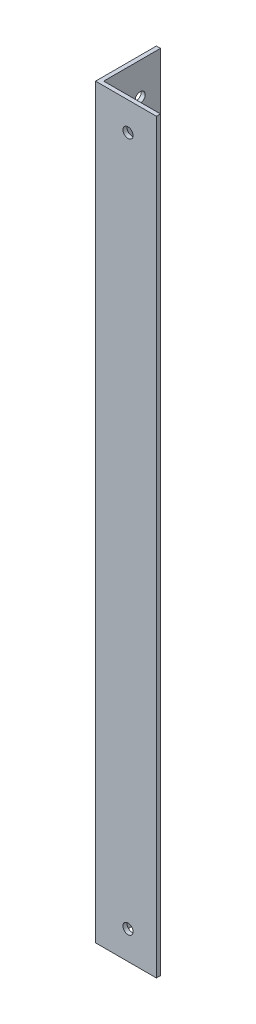
ISO-10303-21;
HEADER;
FILE_DESCRIPTION(('STEP AP214'),'2;1');
FILE_NAME('part.step','',(''),(''),'','','');
FILE_SCHEMA(('AUTOMOTIVE_DESIGN { 1 0 10303 214 1 1 1 1 }'));
ENDSEC;
DATA;
#1=APPLICATION_CONTEXT('core data for automotive mechanical design processes');
#2=APPLICATION_PROTOCOL_DEFINITION('international standard','automotive_design',2000,#1);
#3=PRODUCT_CONTEXT('',#1,'mechanical');
#4=PRODUCT('Part','Part','',(#3));
#5=PRODUCT_RELATED_PRODUCT_CATEGORY('part','',(#4));
#6=PRODUCT_DEFINITION_FORMATION('','',#4);
#7=PRODUCT_DEFINITION_CONTEXT('part definition',#1,'design');
#8=PRODUCT_DEFINITION('design','',#6,#7);
#9=PRODUCT_DEFINITION_SHAPE('','',#8);
#10=(LENGTH_UNIT() NAMED_UNIT(*) SI_UNIT(.MILLI.,.METRE.));
#11=(NAMED_UNIT(*) PLANE_ANGLE_UNIT() SI_UNIT($,.RADIAN.));
#12=(NAMED_UNIT(*) SI_UNIT($,.STERADIAN.) SOLID_ANGLE_UNIT());
#13=UNCERTAINTY_MEASURE_WITH_UNIT(LENGTH_MEASURE(1.E-05),#10,'distance_accuracy_value','');
#14=(GEOMETRIC_REPRESENTATION_CONTEXT(3) GLOBAL_UNCERTAINTY_ASSIGNED_CONTEXT((#13)) GLOBAL_UNIT_ASSIGNED_CONTEXT((#10,
#11,#12)) REPRESENTATION_CONTEXT('',''));
#15=CARTESIAN_POINT('',(0.,0.,0.));
#16=DIRECTION('',(0.,0.,1.));
#17=DIRECTION('',(1.,0.,0.));
#18=AXIS2_PLACEMENT_3D('',#15,#16,#17);
#19=CARTESIAN_POINT('',(0.,184.,0.));
#20=DIRECTION('',(0.,0.,1.));
#21=DIRECTION('',(1.,0.,0.));
#22=AXIS2_PLACEMENT_3D('',#19,#20,#21);
#23=PLANE('',#22);
#24=CARTESIAN_POINT('',(8.,7.,0.));
#25=DIRECTION('',(0.,0.,1.));
#26=DIRECTION('',(1.,0.,0.));
#27=AXIS2_PLACEMENT_3D('',#24,#25,#26);
#28=CIRCLE('',#27,1.24999999999999);
#29=CARTESIAN_POINT('',(9.24999999999998,7.,0.));
#30=VERTEX_POINT('',#29);
#31=EDGE_CURVE('E185',#30,#30,#28,.T.);
#32=ORIENTED_EDGE('',*,*,#31,.T.);
#33=EDGE_LOOP('',(#32));
#34=FACE_BOUND('',#33,.T.);
#35=CARTESIAN_POINT('',(8.,177.,0.));
#36=DIRECTION('',(0.,0.,1.));
#37=DIRECTION('',(1.,0.,0.));
#38=AXIS2_PLACEMENT_3D('',#35,#36,#37);
#39=CIRCLE('',#38,1.24999999999999);
#40=CARTESIAN_POINT('',(9.24999999999998,177.,0.));
#41=VERTEX_POINT('',#40);
#42=EDGE_CURVE('E184',#41,#41,#39,.T.);
#43=ORIENTED_EDGE('',*,*,#42,.T.);
#44=EDGE_LOOP('',(#43));
#45=FACE_BOUND('',#44,.T.);
#46=DIRECTION('',(0.,-1.,0.));
#47=VECTOR('',#46,1.);
#48=CARTESIAN_POINT('',(1.,184.,0.));
#49=LINE('',#48,#47);
#50=CARTESIAN_POINT('',(0.999999999999988,184.,0.));
#51=VERTEX_POINT('',#50);
#52=CARTESIAN_POINT('',(0.999999999999977,0.,0.));
#53=VERTEX_POINT('',#52);
#54=EDGE_CURVE('E49',#51,#53,#49,.T.);
#55=ORIENTED_EDGE('',*,*,#54,.F.);
#56=DIRECTION('',(-1.,0.,0.));
#57=VECTOR('',#56,1.);
#58=CARTESIAN_POINT('',(0.,184.,0.));
#59=LINE('',#58,#57);
#60=CARTESIAN_POINT('',(15.,184.,0.));
#61=VERTEX_POINT('',#60);
#62=EDGE_CURVE('E132',#61,#51,#59,.T.);
#63=ORIENTED_EDGE('',*,*,#62,.F.);
#64=DIRECTION('',(0.,-1.,0.));
#65=VECTOR('',#64,1.);
#66=CARTESIAN_POINT('',(15.,184.,0.));
#67=LINE('',#66,#65);
#68=CARTESIAN_POINT('',(15.,0.,0.));
#69=VERTEX_POINT('',#68);
#70=EDGE_CURVE('E134',#61,#69,#67,.T.);
#71=ORIENTED_EDGE('',*,*,#70,.T.);
#72=DIRECTION('',(-1.,0.,0.));
#73=VECTOR('',#72,1.);
#74=CARTESIAN_POINT('',(0.,0.,0.));
#75=LINE('',#74,#73);
#76=EDGE_CURVE('E102',#69,#53,#75,.T.);
#77=ORIENTED_EDGE('',*,*,#76,.T.);
#78=EDGE_LOOP('',(#55,#63,#71,#77));
#79=FACE_BOUND('',#78,.T.);
#80=ADVANCED_FACE('F34',(#34,#45,#79),#23,.F.);
#81=CARTESIAN_POINT('',(0.,184.,0.));
#82=DIRECTION('',(1.,0.,0.));
#83=DIRECTION('',(0.,0.,-1.));
#84=AXIS2_PLACEMENT_3D('',#81,#82,#83);
#85=PLANE('',#84);
#86=CARTESIAN_POINT('',(0.,8.,-9.));
#87=DIRECTION('',(-1.,0.,0.));
#88=DIRECTION('',(0.,0.,1.));
#89=AXIS2_PLACEMENT_3D('',#86,#87,#88);
#90=CIRCLE('',#89,1.24999999999999);
#91=CARTESIAN_POINT('',(0.,8.,-7.75000000000001));
#92=VERTEX_POINT('',#91);
#93=EDGE_CURVE('E188',#92,#92,#90,.T.);
#94=ORIENTED_EDGE('',*,*,#93,.F.);
#95=EDGE_LOOP('',(#94));
#96=FACE_BOUND('',#95,.T.);
#97=CARTESIAN_POINT('',(0.,176.,-9.));
#98=DIRECTION('',(-1.,0.,0.));
#99=DIRECTION('',(0.,0.,1.));
#100=AXIS2_PLACEMENT_3D('',#97,#98,#99);
#101=CIRCLE('',#100,1.24999999999997);
#102=CARTESIAN_POINT('',(0.,176.,-7.75000000000003));
#103=VERTEX_POINT('',#102);
#104=EDGE_CURVE('E196',#103,#103,#101,.T.);
#105=ORIENTED_EDGE('',*,*,#104,.F.);
#106=EDGE_LOOP('',(#105));
#107=FACE_BOUND('',#106,.T.);
#108=DIRECTION('',(0.,0.,1.));
#109=VECTOR('',#108,1.);
#110=CARTESIAN_POINT('',(0.,0.,0.));
#111=LINE('',#110,#109);
#112=CARTESIAN_POINT('',(0.,0.,-14.));
#113=VERTEX_POINT('',#112);
#114=CARTESIAN_POINT('',(0.,0.,1.));
#115=VERTEX_POINT('',#114);
#116=EDGE_CURVE('E128',#113,#115,#111,.T.);
#117=ORIENTED_EDGE('',*,*,#116,.T.);
#118=DIRECTION('',(0.,-1.,0.));
#119=VECTOR('',#118,1.);
#120=CARTESIAN_POINT('',(0.,184.,1.));
#121=LINE('',#120,#119);
#122=CARTESIAN_POINT('',(0.,184.,1.));
#123=VERTEX_POINT('',#122);
#124=EDGE_CURVE('E11',#123,#115,#121,.T.);
#125=ORIENTED_EDGE('',*,*,#124,.F.);
#126=DIRECTION('',(0.,0.,1.));
#127=VECTOR('',#126,1.);
#128=CARTESIAN_POINT('',(0.,184.,0.));
#129=LINE('',#128,#127);
#130=CARTESIAN_POINT('',(0.,184.,-14.));
#131=VERTEX_POINT('',#130);
#132=EDGE_CURVE('E97',#131,#123,#129,.T.);
#133=ORIENTED_EDGE('',*,*,#132,.F.);
#134=DIRECTION('',(0.,1.,0.));
#135=VECTOR('',#134,1.);
#136=CARTESIAN_POINT('',(0.,184.,-14.));
#137=LINE('',#136,#135);
#138=EDGE_CURVE('E101',#113,#131,#137,.T.);
#139=ORIENTED_EDGE('',*,*,#138,.F.);
#140=EDGE_LOOP('',(#117,#125,#133,#139));
#141=FACE_BOUND('',#140,.T.);
#142=ADVANCED_FACE('F36',(#96,#107,#141),#85,.F.);
#143=CARTESIAN_POINT('',(0.,184.,1.));
#144=DIRECTION('',(0.,0.,-1.));
#145=DIRECTION('',(-1.,0.,0.));
#146=AXIS2_PLACEMENT_3D('',#143,#144,#145);
#147=PLANE('',#146);
#148=CARTESIAN_POINT('',(8.,7.,1.));
#149=DIRECTION('',(0.,0.,1.));
#150=DIRECTION('',(1.,0.,0.));
#151=AXIS2_PLACEMENT_3D('',#148,#149,#150);
#152=CIRCLE('',#151,1.24999999999999);
#153=CARTESIAN_POINT('',(9.24999999999998,7.,1.));
#154=VERTEX_POINT('',#153);
#155=EDGE_CURVE('E179',#154,#154,#152,.T.);
#156=ORIENTED_EDGE('',*,*,#155,.F.);
#157=EDGE_LOOP('',(#156));
#158=FACE_BOUND('',#157,.T.);
#159=CARTESIAN_POINT('',(8.,177.,1.));
#160=DIRECTION('',(0.,0.,1.));
#161=DIRECTION('',(1.,0.,0.));
#162=AXIS2_PLACEMENT_3D('',#159,#160,#161);
#163=CIRCLE('',#162,1.24999999999999);
#164=CARTESIAN_POINT('',(9.24999999999998,177.,1.));
#165=VERTEX_POINT('',#164);
#166=EDGE_CURVE('E182',#165,#165,#163,.T.);
#167=ORIENTED_EDGE('',*,*,#166,.F.);
#168=EDGE_LOOP('',(#167));
#169=FACE_BOUND('',#168,.T.);
#170=DIRECTION('',(1.,0.,0.));
#171=VECTOR('',#170,1.);
#172=CARTESIAN_POINT('',(0.,0.,1.));
#173=LINE('',#172,#171);
#174=CARTESIAN_POINT('',(15.,0.,1.));
#175=VERTEX_POINT('',#174);
#176=EDGE_CURVE('E136',#115,#175,#173,.T.);
#177=ORIENTED_EDGE('',*,*,#176,.T.);
#178=DIRECTION('',(0.,-1.,0.));
#179=VECTOR('',#178,1.);
#180=CARTESIAN_POINT('',(15.,184.,1.));
#181=LINE('',#180,#179);
#182=CARTESIAN_POINT('',(15.,184.,1.));
#183=VERTEX_POINT('',#182);
#184=EDGE_CURVE('E42',#183,#175,#181,.T.);
#185=ORIENTED_EDGE('',*,*,#184,.F.);
#186=DIRECTION('',(1.,0.,0.));
#187=VECTOR('',#186,1.);
#188=CARTESIAN_POINT('',(0.,184.,1.));
#189=LINE('',#188,#187);
#190=EDGE_CURVE('E79',#123,#183,#189,.T.);
#191=ORIENTED_EDGE('',*,*,#190,.F.);
#192=ORIENTED_EDGE('',*,*,#124,.T.);
#193=EDGE_LOOP('',(#177,#185,#191,#192));
#194=FACE_BOUND('',#193,.T.);
#195=ADVANCED_FACE('F166',(#158,#169,#194),#147,.F.);
#196=CARTESIAN_POINT('',(15.,184.,0.));
#197=DIRECTION('',(-1.,0.,0.));
#198=DIRECTION('',(0.,0.,1.));
#199=AXIS2_PLACEMENT_3D('',#196,#197,#198);
#200=PLANE('',#199);
#201=DIRECTION('',(0.,0.,-1.));
#202=VECTOR('',#201,1.);
#203=CARTESIAN_POINT('',(15.,0.,0.));
#204=LINE('',#203,#202);
#205=EDGE_CURVE('E74',#175,#69,#204,.T.);
#206=ORIENTED_EDGE('',*,*,#205,.T.);
#207=ORIENTED_EDGE('',*,*,#70,.F.);
#208=DIRECTION('',(0.,0.,-1.));
#209=VECTOR('',#208,1.);
#210=CARTESIAN_POINT('',(15.,184.,0.));
#211=LINE('',#210,#209);
#212=EDGE_CURVE('E57',#183,#61,#211,.T.);
#213=ORIENTED_EDGE('',*,*,#212,.F.);
#214=ORIENTED_EDGE('',*,*,#184,.T.);
#215=EDGE_LOOP('',(#206,#207,#213,#214));
#216=FACE_BOUND('',#215,.T.);
#217=ADVANCED_FACE('F140',(#216),#200,.F.);
#218=CARTESIAN_POINT('',(0.,184.,0.));
#219=DIRECTION('',(0.,1.,0.));
#220=DIRECTION('',(0.,0.,1.));
#221=AXIS2_PLACEMENT_3D('',#218,#219,#220);
#222=PLANE('',#221);
#223=ORIENTED_EDGE('',*,*,#132,.T.);
#224=ORIENTED_EDGE('',*,*,#190,.T.);
#225=ORIENTED_EDGE('',*,*,#212,.T.);
#226=ORIENTED_EDGE('',*,*,#62,.T.);
#227=DIRECTION('',(0.,0.,1.));
#228=VECTOR('',#227,1.);
#229=CARTESIAN_POINT('',(1.,184.,-14.));
#230=LINE('',#229,#228);
#231=CARTESIAN_POINT('',(1.,184.,-14.));
#232=VERTEX_POINT('',#231);
#233=EDGE_CURVE('E108',#232,#51,#230,.T.);
#234=ORIENTED_EDGE('',*,*,#233,.F.);
#235=DIRECTION('',(1.,0.,0.));
#236=VECTOR('',#235,1.);
#237=CARTESIAN_POINT('',(0.,184.,-14.));
#238=LINE('',#237,#236);
#239=EDGE_CURVE('E105',#131,#232,#238,.T.);
#240=ORIENTED_EDGE('',*,*,#239,.F.);
#241=EDGE_LOOP('',(#223,#224,#225,#226,#234,#240));
#242=FACE_BOUND('',#241,.T.);
#243=ADVANCED_FACE('F106',(#242),#222,.T.);
#244=CARTESIAN_POINT('',(0.,0.,0.));
#245=DIRECTION('',(0.,1.,0.));
#246=DIRECTION('',(0.,0.,1.));
#247=AXIS2_PLACEMENT_3D('',#244,#245,#246);
#248=PLANE('',#247);
#249=ORIENTED_EDGE('',*,*,#116,.F.);
#250=DIRECTION('',(-1.,0.,0.));
#251=VECTOR('',#250,1.);
#252=CARTESIAN_POINT('',(0.,0.,-14.));
#253=LINE('',#252,#251);
#254=CARTESIAN_POINT('',(0.999999999999977,0.,-14.));
#255=VERTEX_POINT('',#254);
#256=EDGE_CURVE('E116',#255,#113,#253,.T.);
#257=ORIENTED_EDGE('',*,*,#256,.F.);
#258=DIRECTION('',(0.,0.,1.));
#259=VECTOR('',#258,1.);
#260=CARTESIAN_POINT('',(0.999999999999977,0.,-14.));
#261=LINE('',#260,#259);
#262=EDGE_CURVE('E124',#255,#53,#261,.T.);
#263=ORIENTED_EDGE('',*,*,#262,.T.);
#264=ORIENTED_EDGE('',*,*,#76,.F.);
#265=ORIENTED_EDGE('',*,*,#205,.F.);
#266=ORIENTED_EDGE('',*,*,#176,.F.);
#267=EDGE_LOOP('',(#249,#257,#263,#264,#265,#266));
#268=FACE_BOUND('',#267,.T.);
#269=ADVANCED_FACE('F143',(#268),#248,.F.);
#270=CARTESIAN_POINT('',(1.,184.,-14.));
#271=DIRECTION('',(-1.,0.,0.));
#272=DIRECTION('',(0.,-1.,0.));
#273=AXIS2_PLACEMENT_3D('',#270,#271,#272);
#274=PLANE('',#273);
#275=CARTESIAN_POINT('',(0.999999999999979,8.,-9.));
#276=DIRECTION('',(-1.,0.,0.));
#277=DIRECTION('',(0.,-1.,0.));
#278=AXIS2_PLACEMENT_3D('',#275,#276,#277);
#279=CIRCLE('',#278,1.24999999999999);
#280=CARTESIAN_POINT('',(0.999999999999978,6.75000000000001,-9.));
#281=VERTEX_POINT('',#280);
#282=EDGE_CURVE('E195',#281,#281,#279,.T.);
#283=ORIENTED_EDGE('',*,*,#282,.T.);
#284=EDGE_LOOP('',(#283));
#285=FACE_BOUND('',#284,.T.);
#286=CARTESIAN_POINT('',(0.999999999999999,176.,-9.));
#287=DIRECTION('',(-1.,0.,0.));
#288=DIRECTION('',(0.,-1.,0.));
#289=AXIS2_PLACEMENT_3D('',#286,#287,#288);
#290=CIRCLE('',#289,1.24999999999997);
#291=CARTESIAN_POINT('',(0.999999999999999,174.75,-9.));
#292=VERTEX_POINT('',#291);
#293=EDGE_CURVE('E118',#292,#292,#290,.T.);
#294=ORIENTED_EDGE('',*,*,#293,.T.);
#295=EDGE_LOOP('',(#294));
#296=FACE_BOUND('',#295,.T.);
#297=ORIENTED_EDGE('',*,*,#54,.T.);
#298=ORIENTED_EDGE('',*,*,#262,.F.);
#299=DIRECTION('',(0.,-1.,0.));
#300=VECTOR('',#299,1.);
#301=CARTESIAN_POINT('',(1.,184.,-14.));
#302=LINE('',#301,#300);
#303=EDGE_CURVE('E111',#232,#255,#302,.T.);
#304=ORIENTED_EDGE('',*,*,#303,.F.);
#305=ORIENTED_EDGE('',*,*,#233,.T.);
#306=EDGE_LOOP('',(#297,#298,#304,#305));
#307=FACE_BOUND('',#306,.T.);
#308=ADVANCED_FACE('F146',(#285,#296,#307),#274,.F.);
#309=CARTESIAN_POINT('',(0.,0.,-14.));
#310=DIRECTION('',(0.,0.,1.));
#311=DIRECTION('',(1.,0.,0.));
#312=AXIS2_PLACEMENT_3D('',#309,#310,#311);
#313=PLANE('',#312);
#314=ORIENTED_EDGE('',*,*,#138,.T.);
#315=ORIENTED_EDGE('',*,*,#239,.T.);
#316=ORIENTED_EDGE('',*,*,#303,.T.);
#317=ORIENTED_EDGE('',*,*,#256,.T.);
#318=EDGE_LOOP('',(#314,#315,#316,#317));
#319=FACE_BOUND('',#318,.T.);
#320=ADVANCED_FACE('F114',(#319),#313,.F.);
#321=CARTESIAN_POINT('',(0.,176.,-9.));
#322=DIRECTION('',(-1.,0.,0.));
#323=DIRECTION('',(0.,0.,1.));
#324=AXIS2_PLACEMENT_3D('',#321,#322,#323);
#325=CYLINDRICAL_SURFACE('',#324,1.24999999999997);
#326=ORIENTED_EDGE('',*,*,#104,.T.);
#327=EDGE_LOOP('',(#326));
#328=FACE_BOUND('',#327,.T.);
#329=ORIENTED_EDGE('',*,*,#293,.F.);
#330=EDGE_LOOP('',(#329));
#331=FACE_BOUND('',#330,.T.);
#332=ADVANCED_FACE('F154',(#328,#331),#325,.F.);
#333=CARTESIAN_POINT('',(0.,8.,-9.));
#334=DIRECTION('',(-1.,0.,0.));
#335=DIRECTION('',(0.,0.,1.));
#336=AXIS2_PLACEMENT_3D('',#333,#334,#335);
#337=CYLINDRICAL_SURFACE('',#336,1.24999999999999);
#338=ORIENTED_EDGE('',*,*,#93,.T.);
#339=EDGE_LOOP('',(#338));
#340=FACE_BOUND('',#339,.T.);
#341=ORIENTED_EDGE('',*,*,#282,.F.);
#342=EDGE_LOOP('',(#341));
#343=FACE_BOUND('',#342,.T.);
#344=ADVANCED_FACE('F204',(#340,#343),#337,.F.);
#345=CARTESIAN_POINT('',(8.,177.,1.));
#346=DIRECTION('',(0.,0.,1.));
#347=DIRECTION('',(1.,0.,0.));
#348=AXIS2_PLACEMENT_3D('',#345,#346,#347);
#349=CYLINDRICAL_SURFACE('',#348,1.24999999999999);
#350=ORIENTED_EDGE('',*,*,#166,.T.);
#351=EDGE_LOOP('',(#350));
#352=FACE_BOUND('',#351,.T.);
#353=ORIENTED_EDGE('',*,*,#42,.F.);
#354=EDGE_LOOP('',(#353));
#355=FACE_BOUND('',#354,.T.);
#356=ADVANCED_FACE('F209',(#352,#355),#349,.F.);
#357=CARTESIAN_POINT('',(8.,7.,1.));
#358=DIRECTION('',(0.,0.,1.));
#359=DIRECTION('',(1.,0.,0.));
#360=AXIS2_PLACEMENT_3D('',#357,#358,#359);
#361=CYLINDRICAL_SURFACE('',#360,1.24999999999999);
#362=ORIENTED_EDGE('',*,*,#155,.T.);
#363=EDGE_LOOP('',(#362));
#364=FACE_BOUND('',#363,.T.);
#365=ORIENTED_EDGE('',*,*,#31,.F.);
#366=EDGE_LOOP('',(#365));
#367=FACE_BOUND('',#366,.T.);
#368=ADVANCED_FACE('F215',(#364,#367),#361,.F.);
#369=CLOSED_SHELL('',(#80,#142,#195,#217,#243,#269,#308,#320,#332,#344,#356,#368));
#370=MANIFOLD_SOLID_BREP('B2',#369);
#371=ADVANCED_BREP_SHAPE_REPRESENTATION('',(#18,#370),#14);
#372=SHAPE_DEFINITION_REPRESENTATION(#9,#371);
ENDSEC;
END-ISO-10303-21;
